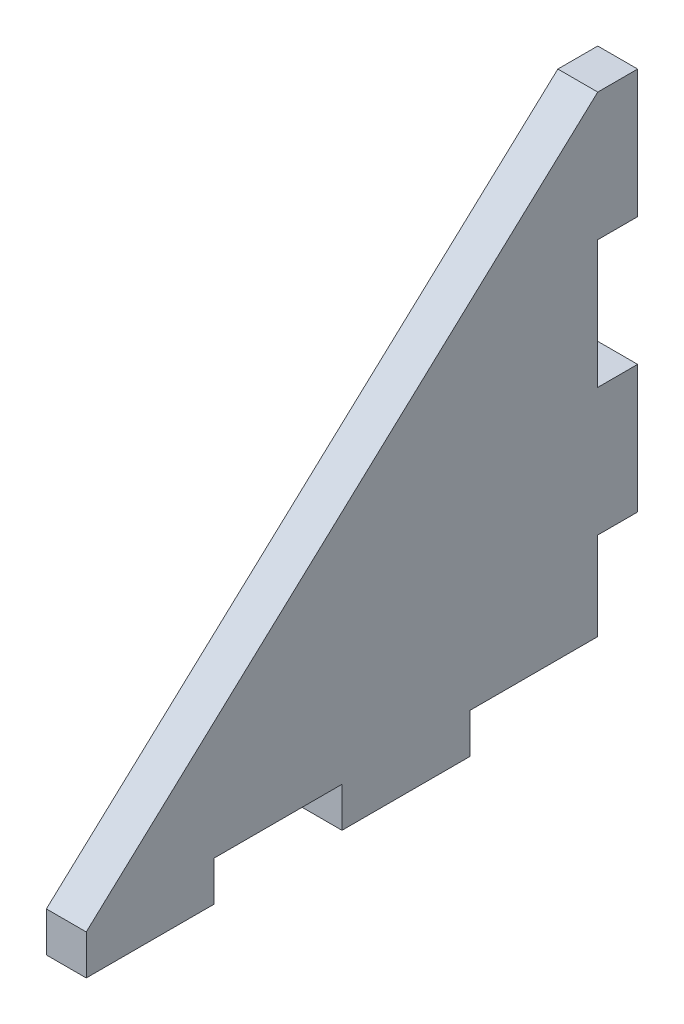
ISO-10303-21;
HEADER;
FILE_DESCRIPTION(('STEP AP214'),'2;1');
FILE_NAME('part.step','',(''),(''),'','','');
FILE_SCHEMA(('AUTOMOTIVE_DESIGN { 1 0 10303 214 1 1 1 1 }'));
ENDSEC;
DATA;
#1=APPLICATION_CONTEXT('core data for automotive mechanical design processes');
#2=APPLICATION_PROTOCOL_DEFINITION('international standard','automotive_design',2000,#1);
#3=PRODUCT_CONTEXT('',#1,'mechanical');
#4=PRODUCT('Part','Part','',(#3));
#5=PRODUCT_RELATED_PRODUCT_CATEGORY('part','',(#4));
#6=PRODUCT_DEFINITION_FORMATION('','',#4);
#7=PRODUCT_DEFINITION_CONTEXT('part definition',#1,'design');
#8=PRODUCT_DEFINITION('design','',#6,#7);
#9=PRODUCT_DEFINITION_SHAPE('','',#8);
#10=(LENGTH_UNIT() NAMED_UNIT(*) SI_UNIT(.MILLI.,.METRE.));
#11=(NAMED_UNIT(*) PLANE_ANGLE_UNIT() SI_UNIT($,.RADIAN.));
#12=(NAMED_UNIT(*) SI_UNIT($,.STERADIAN.) SOLID_ANGLE_UNIT());
#13=UNCERTAINTY_MEASURE_WITH_UNIT(LENGTH_MEASURE(1.E-05),#10,'distance_accuracy_value','');
#14=(GEOMETRIC_REPRESENTATION_CONTEXT(3) GLOBAL_UNCERTAINTY_ASSIGNED_CONTEXT((#13)) GLOBAL_UNIT_ASSIGNED_CONTEXT((#10,
#11,#12)) REPRESENTATION_CONTEXT('',''));
#15=CARTESIAN_POINT('',(0.,0.,0.));
#16=DIRECTION('',(0.,0.,1.));
#17=DIRECTION('',(1.,0.,0.));
#18=AXIS2_PLACEMENT_3D('',#15,#16,#17);
#19=CARTESIAN_POINT('',(3.12,3.12,43.12));
#20=DIRECTION('',(0.,0.735197931303207,0.677852492661556));
#21=DIRECTION('',(0.,-0.677852492661557,0.735197931303207));
#22=AXIS2_PLACEMENT_3D('',#19,#20,#21);
#23=PLANE('',#22);
#24=DIRECTION('',(0.,0.677852492661556,-0.735197931303207));
#25=VECTOR('',#24,1.);
#26=CARTESIAN_POINT('',(0.,3.12,43.12));
#27=LINE('',#26,#25);
#28=CARTESIAN_POINT('',(0.,3.12,43.12));
#29=VERTEX_POINT('',#28);
#30=CARTESIAN_POINT('',(0.,40.,3.12));
#31=VERTEX_POINT('',#30);
#32=EDGE_CURVE('E183',#29,#31,#27,.T.);
#33=ORIENTED_EDGE('',*,*,#32,.F.);
#34=DIRECTION('',(-1.,0.,0.));
#35=VECTOR('',#34,1.);
#36=CARTESIAN_POINT('',(3.12,3.12,43.12));
#37=LINE('',#36,#35);
#38=CARTESIAN_POINT('',(3.12,3.12,43.12));
#39=VERTEX_POINT('',#38);
#40=EDGE_CURVE('E11',#39,#29,#37,.T.);
#41=ORIENTED_EDGE('',*,*,#40,.F.);
#42=DIRECTION('',(0.,0.677852492661556,-0.735197931303207));
#43=VECTOR('',#42,1.);
#44=CARTESIAN_POINT('',(3.12,3.12,43.12));
#45=LINE('',#44,#43);
#46=CARTESIAN_POINT('',(3.12,40.,3.12));
#47=VERTEX_POINT('',#46);
#48=EDGE_CURVE('E230',#39,#47,#45,.T.);
#49=ORIENTED_EDGE('',*,*,#48,.T.);
#50=DIRECTION('',(-1.,0.,0.));
#51=VECTOR('',#50,1.);
#52=CARTESIAN_POINT('',(3.12,40.,3.12));
#53=LINE('',#52,#51);
#54=EDGE_CURVE('E35',#47,#31,#53,.T.);
#55=ORIENTED_EDGE('',*,*,#54,.T.);
#56=EDGE_LOOP('',(#33,#41,#49,#55));
#57=FACE_BOUND('',#56,.T.);
#58=ADVANCED_FACE('F32',(#57),#23,.T.);
#59=CARTESIAN_POINT('',(3.12,0.,43.12));
#60=DIRECTION('',(0.,0.,1.));
#61=DIRECTION('',(1.,0.,0.));
#62=AXIS2_PLACEMENT_3D('',#59,#60,#61);
#63=PLANE('',#62);
#64=DIRECTION('',(0.,1.,0.));
#65=VECTOR('',#64,1.);
#66=CARTESIAN_POINT('',(0.,0.,43.12));
#67=LINE('',#66,#65);
#68=CARTESIAN_POINT('',(0.,0.,43.12));
#69=VERTEX_POINT('',#68);
#70=EDGE_CURVE('E228',#69,#29,#67,.T.);
#71=ORIENTED_EDGE('',*,*,#70,.F.);
#72=DIRECTION('',(-1.,0.,0.));
#73=VECTOR('',#72,1.);
#74=CARTESIAN_POINT('',(3.12,0.,43.12));
#75=LINE('',#74,#73);
#76=CARTESIAN_POINT('',(3.12,0.,43.12));
#77=VERTEX_POINT('',#76);
#78=EDGE_CURVE('E41',#77,#69,#75,.T.);
#79=ORIENTED_EDGE('',*,*,#78,.F.);
#80=DIRECTION('',(0.,1.,0.));
#81=VECTOR('',#80,1.);
#82=CARTESIAN_POINT('',(3.12,0.,43.12));
#83=LINE('',#82,#81);
#84=EDGE_CURVE('E173',#77,#39,#83,.T.);
#85=ORIENTED_EDGE('',*,*,#84,.T.);
#86=ORIENTED_EDGE('',*,*,#40,.T.);
#87=EDGE_LOOP('',(#71,#79,#85,#86));
#88=FACE_BOUND('',#87,.T.);
#89=ADVANCED_FACE('F260',(#88),#63,.T.);
#90=CARTESIAN_POINT('',(3.12,0.,33.12));
#91=DIRECTION('',(0.,-1.,0.));
#92=DIRECTION('',(0.,0.,-1.));
#93=AXIS2_PLACEMENT_3D('',#90,#91,#92);
#94=PLANE('',#93);
#95=DIRECTION('',(0.,0.,1.));
#96=VECTOR('',#95,1.);
#97=CARTESIAN_POINT('',(0.,0.,33.12));
#98=LINE('',#97,#96);
#99=CARTESIAN_POINT('',(0.,0.,33.12));
#100=VERTEX_POINT('',#99);
#101=EDGE_CURVE('E160',#100,#69,#98,.T.);
#102=ORIENTED_EDGE('',*,*,#101,.F.);
#103=DIRECTION('',(-1.,0.,0.));
#104=VECTOR('',#103,1.);
#105=CARTESIAN_POINT('',(3.12,0.,33.12));
#106=LINE('',#105,#104);
#107=CARTESIAN_POINT('',(3.12,0.,33.12));
#108=VERTEX_POINT('',#107);
#109=EDGE_CURVE('E155',#108,#100,#106,.T.);
#110=ORIENTED_EDGE('',*,*,#109,.F.);
#111=DIRECTION('',(0.,0.,1.));
#112=VECTOR('',#111,1.);
#113=CARTESIAN_POINT('',(3.12,0.,33.12));
#114=LINE('',#113,#112);
#115=EDGE_CURVE('E158',#108,#77,#114,.T.);
#116=ORIENTED_EDGE('',*,*,#115,.T.);
#117=ORIENTED_EDGE('',*,*,#78,.T.);
#118=EDGE_LOOP('',(#102,#110,#116,#117));
#119=FACE_BOUND('',#118,.T.);
#120=ADVANCED_FACE('F157',(#119),#94,.T.);
#121=CARTESIAN_POINT('',(3.12,3.12,33.12));
#122=DIRECTION('',(0.,0.,-1.));
#123=DIRECTION('',(-1.,0.,0.));
#124=AXIS2_PLACEMENT_3D('',#121,#122,#123);
#125=PLANE('',#124);
#126=DIRECTION('',(0.,-1.,0.));
#127=VECTOR('',#126,1.);
#128=CARTESIAN_POINT('',(0.,3.12,33.12));
#129=LINE('',#128,#127);
#130=CARTESIAN_POINT('',(0.,3.12,33.12));
#131=VERTEX_POINT('',#130);
#132=EDGE_CURVE('E225',#131,#100,#129,.T.);
#133=ORIENTED_EDGE('',*,*,#132,.F.);
#134=DIRECTION('',(-1.,0.,0.));
#135=VECTOR('',#134,1.);
#136=CARTESIAN_POINT('',(3.12,3.12,33.12));
#137=LINE('',#136,#135);
#138=CARTESIAN_POINT('',(3.12,3.12,33.12));
#139=VERTEX_POINT('',#138);
#140=EDGE_CURVE('E165',#139,#131,#137,.T.);
#141=ORIENTED_EDGE('',*,*,#140,.F.);
#142=DIRECTION('',(0.,-1.,0.));
#143=VECTOR('',#142,1.);
#144=CARTESIAN_POINT('',(3.12,3.12,33.12));
#145=LINE('',#144,#143);
#146=EDGE_CURVE('E171',#139,#108,#145,.T.);
#147=ORIENTED_EDGE('',*,*,#146,.T.);
#148=ORIENTED_EDGE('',*,*,#109,.T.);
#149=EDGE_LOOP('',(#133,#141,#147,#148));
#150=FACE_BOUND('',#149,.T.);
#151=ADVANCED_FACE('F175',(#150),#125,.T.);
#152=CARTESIAN_POINT('',(3.12,3.12,23.12));
#153=DIRECTION('',(0.,-1.,0.));
#154=DIRECTION('',(0.,0.,-1.));
#155=AXIS2_PLACEMENT_3D('',#152,#153,#154);
#156=PLANE('',#155);
#157=DIRECTION('',(0.,0.,1.));
#158=VECTOR('',#157,1.);
#159=CARTESIAN_POINT('',(0.,3.12,23.12));
#160=LINE('',#159,#158);
#161=CARTESIAN_POINT('',(0.,3.12,23.12));
#162=VERTEX_POINT('',#161);
#163=EDGE_CURVE('E222',#162,#131,#160,.T.);
#164=ORIENTED_EDGE('',*,*,#163,.F.);
#165=DIRECTION('',(-1.,0.,0.));
#166=VECTOR('',#165,1.);
#167=CARTESIAN_POINT('',(3.12,3.12,23.12));
#168=LINE('',#167,#166);
#169=CARTESIAN_POINT('',(3.12,3.12,23.12));
#170=VERTEX_POINT('',#169);
#171=EDGE_CURVE('E234',#170,#162,#168,.T.);
#172=ORIENTED_EDGE('',*,*,#171,.F.);
#173=DIRECTION('',(0.,0.,1.));
#174=VECTOR('',#173,1.);
#175=CARTESIAN_POINT('',(3.12,3.12,23.12));
#176=LINE('',#175,#174);
#177=EDGE_CURVE('E176',#170,#139,#176,.T.);
#178=ORIENTED_EDGE('',*,*,#177,.T.);
#179=ORIENTED_EDGE('',*,*,#140,.T.);
#180=EDGE_LOOP('',(#164,#172,#178,#179));
#181=FACE_BOUND('',#180,.T.);
#182=ADVANCED_FACE('F273',(#181),#156,.T.);
#183=CARTESIAN_POINT('',(3.12,0.,23.12));
#184=DIRECTION('',(0.,0.,1.));
#185=DIRECTION('',(1.,0.,0.));
#186=AXIS2_PLACEMENT_3D('',#183,#184,#185);
#187=PLANE('',#186);
#188=DIRECTION('',(0.,1.,0.));
#189=VECTOR('',#188,1.);
#190=CARTESIAN_POINT('',(0.,0.,23.12));
#191=LINE('',#190,#189);
#192=CARTESIAN_POINT('',(0.,0.,23.12));
#193=VERTEX_POINT('',#192);
#194=EDGE_CURVE('E219',#193,#162,#191,.T.);
#195=ORIENTED_EDGE('',*,*,#194,.F.);
#196=DIRECTION('',(-1.,0.,0.));
#197=VECTOR('',#196,1.);
#198=CARTESIAN_POINT('',(3.12,0.,23.12));
#199=LINE('',#198,#197);
#200=CARTESIAN_POINT('',(3.12,0.,23.12));
#201=VERTEX_POINT('',#200);
#202=EDGE_CURVE('E236',#201,#193,#199,.T.);
#203=ORIENTED_EDGE('',*,*,#202,.F.);
#204=DIRECTION('',(0.,1.,0.));
#205=VECTOR('',#204,1.);
#206=CARTESIAN_POINT('',(3.12,0.,23.12));
#207=LINE('',#206,#205);
#208=EDGE_CURVE('E178',#201,#170,#207,.T.);
#209=ORIENTED_EDGE('',*,*,#208,.T.);
#210=ORIENTED_EDGE('',*,*,#171,.T.);
#211=EDGE_LOOP('',(#195,#203,#209,#210));
#212=FACE_BOUND('',#211,.T.);
#213=ADVANCED_FACE('F276',(#212),#187,.T.);
#214=CARTESIAN_POINT('',(3.12,0.,13.12));
#215=DIRECTION('',(0.,-1.,0.));
#216=DIRECTION('',(0.,0.,-1.));
#217=AXIS2_PLACEMENT_3D('',#214,#215,#216);
#218=PLANE('',#217);
#219=DIRECTION('',(0.,0.,1.));
#220=VECTOR('',#219,1.);
#221=CARTESIAN_POINT('',(0.,0.,13.12));
#222=LINE('',#221,#220);
#223=CARTESIAN_POINT('',(0.,0.,13.12));
#224=VERTEX_POINT('',#223);
#225=EDGE_CURVE('E216',#224,#193,#222,.T.);
#226=ORIENTED_EDGE('',*,*,#225,.F.);
#227=DIRECTION('',(-1.,0.,0.));
#228=VECTOR('',#227,1.);
#229=CARTESIAN_POINT('',(3.12,0.,13.12));
#230=LINE('',#229,#228);
#231=CARTESIAN_POINT('',(3.12,0.,13.12));
#232=VERTEX_POINT('',#231);
#233=EDGE_CURVE('E238',#232,#224,#230,.T.);
#234=ORIENTED_EDGE('',*,*,#233,.F.);
#235=DIRECTION('',(0.,0.,1.));
#236=VECTOR('',#235,1.);
#237=CARTESIAN_POINT('',(3.12,0.,13.12));
#238=LINE('',#237,#236);
#239=EDGE_CURVE('E474',#232,#201,#238,.T.);
#240=ORIENTED_EDGE('',*,*,#239,.T.);
#241=ORIENTED_EDGE('',*,*,#202,.T.);
#242=EDGE_LOOP('',(#226,#234,#240,#241));
#243=FACE_BOUND('',#242,.T.);
#244=ADVANCED_FACE('F280',(#243),#218,.T.);
#245=CARTESIAN_POINT('',(3.12,3.12,13.12));
#246=DIRECTION('',(0.,0.,-1.));
#247=DIRECTION('',(-1.,0.,0.));
#248=AXIS2_PLACEMENT_3D('',#245,#246,#247);
#249=PLANE('',#248);
#250=DIRECTION('',(0.,-1.,0.));
#251=VECTOR('',#250,1.);
#252=CARTESIAN_POINT('',(0.,3.12,13.12));
#253=LINE('',#252,#251);
#254=CARTESIAN_POINT('',(0.,3.12,13.12));
#255=VERTEX_POINT('',#254);
#256=EDGE_CURVE('E213',#255,#224,#253,.T.);
#257=ORIENTED_EDGE('',*,*,#256,.F.);
#258=DIRECTION('',(-1.,0.,0.));
#259=VECTOR('',#258,1.);
#260=CARTESIAN_POINT('',(3.12,3.12,13.12));
#261=LINE('',#260,#259);
#262=CARTESIAN_POINT('',(3.12,3.12,13.12));
#263=VERTEX_POINT('',#262);
#264=EDGE_CURVE('E240',#263,#255,#261,.T.);
#265=ORIENTED_EDGE('',*,*,#264,.F.);
#266=DIRECTION('',(0.,-1.,0.));
#267=VECTOR('',#266,1.);
#268=CARTESIAN_POINT('',(3.12,3.12,13.12));
#269=LINE('',#268,#267);
#270=EDGE_CURVE('E467',#263,#232,#269,.T.);
#271=ORIENTED_EDGE('',*,*,#270,.T.);
#272=ORIENTED_EDGE('',*,*,#233,.T.);
#273=EDGE_LOOP('',(#257,#265,#271,#272));
#274=FACE_BOUND('',#273,.T.);
#275=ADVANCED_FACE('F284',(#274),#249,.T.);
#276=CARTESIAN_POINT('',(3.12,3.12,3.12));
#277=DIRECTION('',(0.,-1.,0.));
#278=DIRECTION('',(0.,0.,-1.));
#279=AXIS2_PLACEMENT_3D('',#276,#277,#278);
#280=PLANE('',#279);
#281=DIRECTION('',(0.,0.,1.));
#282=VECTOR('',#281,1.);
#283=CARTESIAN_POINT('',(0.,3.12,3.12));
#284=LINE('',#283,#282);
#285=CARTESIAN_POINT('',(0.,3.12,3.12));
#286=VERTEX_POINT('',#285);
#287=EDGE_CURVE('E210',#286,#255,#284,.T.);
#288=ORIENTED_EDGE('',*,*,#287,.F.);
#289=DIRECTION('',(-1.,0.,0.));
#290=VECTOR('',#289,1.);
#291=CARTESIAN_POINT('',(3.12,3.12,3.12));
#292=LINE('',#291,#290);
#293=CARTESIAN_POINT('',(3.12,3.12,3.12));
#294=VERTEX_POINT('',#293);
#295=EDGE_CURVE('E242',#294,#286,#292,.T.);
#296=ORIENTED_EDGE('',*,*,#295,.F.);
#297=DIRECTION('',(0.,0.,1.));
#298=VECTOR('',#297,1.);
#299=CARTESIAN_POINT('',(3.12,3.12,3.12));
#300=LINE('',#299,#298);
#301=EDGE_CURVE('E463',#294,#263,#300,.T.);
#302=ORIENTED_EDGE('',*,*,#301,.T.);
#303=ORIENTED_EDGE('',*,*,#264,.T.);
#304=EDGE_LOOP('',(#288,#296,#302,#303));
#305=FACE_BOUND('',#304,.T.);
#306=ADVANCED_FACE('F288',(#305),#280,.T.);
#307=CARTESIAN_POINT('',(3.12,10.,3.12));
#308=DIRECTION('',(0.,0.,-1.));
#309=DIRECTION('',(-1.,0.,0.));
#310=AXIS2_PLACEMENT_3D('',#307,#308,#309);
#311=PLANE('',#310);
#312=DIRECTION('',(0.,-1.,0.));
#313=VECTOR('',#312,1.);
#314=CARTESIAN_POINT('',(0.,10.,3.12));
#315=LINE('',#314,#313);
#316=CARTESIAN_POINT('',(0.,10.,3.12));
#317=VERTEX_POINT('',#316);
#318=EDGE_CURVE('E207',#317,#286,#315,.T.);
#319=ORIENTED_EDGE('',*,*,#318,.F.);
#320=DIRECTION('',(-1.,0.,0.));
#321=VECTOR('',#320,1.);
#322=CARTESIAN_POINT('',(3.12,10.,3.12));
#323=LINE('',#322,#321);
#324=CARTESIAN_POINT('',(3.12,10.,3.12));
#325=VERTEX_POINT('',#324);
#326=EDGE_CURVE('E244',#325,#317,#323,.T.);
#327=ORIENTED_EDGE('',*,*,#326,.F.);
#328=DIRECTION('',(0.,-1.,0.));
#329=VECTOR('',#328,1.);
#330=CARTESIAN_POINT('',(3.12,10.,3.12));
#331=LINE('',#330,#329);
#332=EDGE_CURVE('E479',#325,#294,#331,.T.);
#333=ORIENTED_EDGE('',*,*,#332,.T.);
#334=ORIENTED_EDGE('',*,*,#295,.T.);
#335=EDGE_LOOP('',(#319,#327,#333,#334));
#336=FACE_BOUND('',#335,.T.);
#337=ADVANCED_FACE('F292',(#336),#311,.T.);
#338=CARTESIAN_POINT('',(3.12,10.,0.));
#339=DIRECTION('',(0.,-1.,0.));
#340=DIRECTION('',(0.,0.,-1.));
#341=AXIS2_PLACEMENT_3D('',#338,#339,#340);
#342=PLANE('',#341);
#343=DIRECTION('',(0.,0.,1.));
#344=VECTOR('',#343,1.);
#345=CARTESIAN_POINT('',(0.,10.,0.));
#346=LINE('',#345,#344);
#347=CARTESIAN_POINT('',(0.,10.,0.));
#348=VERTEX_POINT('',#347);
#349=EDGE_CURVE('E204',#348,#317,#346,.T.);
#350=ORIENTED_EDGE('',*,*,#349,.F.);
#351=DIRECTION('',(-1.,0.,0.));
#352=VECTOR('',#351,1.);
#353=CARTESIAN_POINT('',(3.12,10.,0.));
#354=LINE('',#353,#352);
#355=CARTESIAN_POINT('',(3.12,10.,0.));
#356=VERTEX_POINT('',#355);
#357=EDGE_CURVE('E246',#356,#348,#354,.T.);
#358=ORIENTED_EDGE('',*,*,#357,.F.);
#359=DIRECTION('',(0.,0.,1.));
#360=VECTOR('',#359,1.);
#361=CARTESIAN_POINT('',(3.12,10.,0.));
#362=LINE('',#361,#360);
#363=EDGE_CURVE('E456',#356,#325,#362,.T.);
#364=ORIENTED_EDGE('',*,*,#363,.T.);
#365=ORIENTED_EDGE('',*,*,#326,.T.);
#366=EDGE_LOOP('',(#350,#358,#364,#365));
#367=FACE_BOUND('',#366,.T.);
#368=ADVANCED_FACE('F296',(#367),#342,.T.);
#369=CARTESIAN_POINT('',(3.12,20.,0.));
#370=DIRECTION('',(0.,0.,-1.));
#371=DIRECTION('',(-1.,0.,0.));
#372=AXIS2_PLACEMENT_3D('',#369,#370,#371);
#373=PLANE('',#372);
#374=DIRECTION('',(0.,-1.,0.));
#375=VECTOR('',#374,1.);
#376=CARTESIAN_POINT('',(0.,20.,0.));
#377=LINE('',#376,#375);
#378=CARTESIAN_POINT('',(0.,20.,0.));
#379=VERTEX_POINT('',#378);
#380=EDGE_CURVE('E201',#379,#348,#377,.T.);
#381=ORIENTED_EDGE('',*,*,#380,.F.);
#382=DIRECTION('',(-1.,0.,0.));
#383=VECTOR('',#382,1.);
#384=CARTESIAN_POINT('',(3.12,20.,0.));
#385=LINE('',#384,#383);
#386=CARTESIAN_POINT('',(3.12,20.,0.));
#387=VERTEX_POINT('',#386);
#388=EDGE_CURVE('E248',#387,#379,#385,.T.);
#389=ORIENTED_EDGE('',*,*,#388,.F.);
#390=DIRECTION('',(0.,-1.,0.));
#391=VECTOR('',#390,1.);
#392=CARTESIAN_POINT('',(3.12,20.,0.));
#393=LINE('',#392,#391);
#394=EDGE_CURVE('E452',#387,#356,#393,.T.);
#395=ORIENTED_EDGE('',*,*,#394,.T.);
#396=ORIENTED_EDGE('',*,*,#357,.T.);
#397=EDGE_LOOP('',(#381,#389,#395,#396));
#398=FACE_BOUND('',#397,.T.);
#399=ADVANCED_FACE('F300',(#398),#373,.T.);
#400=CARTESIAN_POINT('',(3.12,20.,3.12));
#401=DIRECTION('',(0.,1.,0.));
#402=DIRECTION('',(0.,0.,1.));
#403=AXIS2_PLACEMENT_3D('',#400,#401,#402);
#404=PLANE('',#403);
#405=DIRECTION('',(0.,0.,-1.));
#406=VECTOR('',#405,1.);
#407=CARTESIAN_POINT('',(0.,20.,3.12));
#408=LINE('',#407,#406);
#409=CARTESIAN_POINT('',(0.,20.,3.12));
#410=VERTEX_POINT('',#409);
#411=EDGE_CURVE('E198',#410,#379,#408,.T.);
#412=ORIENTED_EDGE('',*,*,#411,.F.);
#413=DIRECTION('',(-1.,0.,0.));
#414=VECTOR('',#413,1.);
#415=CARTESIAN_POINT('',(3.12,20.,3.12));
#416=LINE('',#415,#414);
#417=CARTESIAN_POINT('',(3.12,20.,3.12));
#418=VERTEX_POINT('',#417);
#419=EDGE_CURVE('E250',#418,#410,#416,.T.);
#420=ORIENTED_EDGE('',*,*,#419,.F.);
#421=DIRECTION('',(0.,0.,-1.));
#422=VECTOR('',#421,1.);
#423=CARTESIAN_POINT('',(3.12,20.,3.12));
#424=LINE('',#423,#422);
#425=EDGE_CURVE('E483',#418,#387,#424,.T.);
#426=ORIENTED_EDGE('',*,*,#425,.T.);
#427=ORIENTED_EDGE('',*,*,#388,.T.);
#428=EDGE_LOOP('',(#412,#420,#426,#427));
#429=FACE_BOUND('',#428,.T.);
#430=ADVANCED_FACE('F304',(#429),#404,.T.);
#431=CARTESIAN_POINT('',(3.12,30.,3.12));
#432=DIRECTION('',(0.,0.,-1.));
#433=DIRECTION('',(-1.,0.,0.));
#434=AXIS2_PLACEMENT_3D('',#431,#432,#433);
#435=PLANE('',#434);
#436=DIRECTION('',(0.,-1.,0.));
#437=VECTOR('',#436,1.);
#438=CARTESIAN_POINT('',(0.,30.,3.12));
#439=LINE('',#438,#437);
#440=CARTESIAN_POINT('',(0.,30.,3.12));
#441=VERTEX_POINT('',#440);
#442=EDGE_CURVE('E195',#441,#410,#439,.T.);
#443=ORIENTED_EDGE('',*,*,#442,.F.);
#444=DIRECTION('',(-1.,0.,0.));
#445=VECTOR('',#444,1.);
#446=CARTESIAN_POINT('',(3.12,30.,3.12));
#447=LINE('',#446,#445);
#448=CARTESIAN_POINT('',(3.12,30.,3.12));
#449=VERTEX_POINT('',#448);
#450=EDGE_CURVE('E252',#449,#441,#447,.T.);
#451=ORIENTED_EDGE('',*,*,#450,.F.);
#452=DIRECTION('',(0.,-1.,0.));
#453=VECTOR('',#452,1.);
#454=CARTESIAN_POINT('',(3.12,30.,3.12));
#455=LINE('',#454,#453);
#456=EDGE_CURVE('E445',#449,#418,#455,.T.);
#457=ORIENTED_EDGE('',*,*,#456,.T.);
#458=ORIENTED_EDGE('',*,*,#419,.T.);
#459=EDGE_LOOP('',(#443,#451,#457,#458));
#460=FACE_BOUND('',#459,.T.);
#461=ADVANCED_FACE('F308',(#460),#435,.T.);
#462=CARTESIAN_POINT('',(3.12,30.,0.));
#463=DIRECTION('',(0.,-1.,0.));
#464=DIRECTION('',(0.,0.,-1.));
#465=AXIS2_PLACEMENT_3D('',#462,#463,#464);
#466=PLANE('',#465);
#467=DIRECTION('',(0.,0.,1.));
#468=VECTOR('',#467,1.);
#469=CARTESIAN_POINT('',(0.,30.,0.));
#470=LINE('',#469,#468);
#471=CARTESIAN_POINT('',(0.,30.,0.));
#472=VERTEX_POINT('',#471);
#473=EDGE_CURVE('E192',#472,#441,#470,.T.);
#474=ORIENTED_EDGE('',*,*,#473,.F.);
#475=DIRECTION('',(-1.,0.,0.));
#476=VECTOR('',#475,1.);
#477=CARTESIAN_POINT('',(3.12,30.,0.));
#478=LINE('',#477,#476);
#479=CARTESIAN_POINT('',(3.12,30.,0.));
#480=VERTEX_POINT('',#479);
#481=EDGE_CURVE('E254',#480,#472,#478,.T.);
#482=ORIENTED_EDGE('',*,*,#481,.F.);
#483=DIRECTION('',(0.,0.,1.));
#484=VECTOR('',#483,1.);
#485=CARTESIAN_POINT('',(3.12,30.,0.));
#486=LINE('',#485,#484);
#487=EDGE_CURVE('E441',#480,#449,#486,.T.);
#488=ORIENTED_EDGE('',*,*,#487,.T.);
#489=ORIENTED_EDGE('',*,*,#450,.T.);
#490=EDGE_LOOP('',(#474,#482,#488,#489));
#491=FACE_BOUND('',#490,.T.);
#492=ADVANCED_FACE('F312',(#491),#466,.T.);
#493=CARTESIAN_POINT('',(3.12,40.,0.));
#494=DIRECTION('',(0.,0.,-1.));
#495=DIRECTION('',(-1.,0.,0.));
#496=AXIS2_PLACEMENT_3D('',#493,#494,#495);
#497=PLANE('',#496);
#498=DIRECTION('',(0.,-1.,0.));
#499=VECTOR('',#498,1.);
#500=CARTESIAN_POINT('',(0.,40.,0.));
#501=LINE('',#500,#499);
#502=CARTESIAN_POINT('',(0.,40.,0.));
#503=VERTEX_POINT('',#502);
#504=EDGE_CURVE('E189',#503,#472,#501,.T.);
#505=ORIENTED_EDGE('',*,*,#504,.F.);
#506=DIRECTION('',(-1.,0.,0.));
#507=VECTOR('',#506,1.);
#508=CARTESIAN_POINT('',(3.12,40.,0.));
#509=LINE('',#508,#507);
#510=CARTESIAN_POINT('',(3.12,40.,0.));
#511=VERTEX_POINT('',#510);
#512=EDGE_CURVE('E255',#511,#503,#509,.T.);
#513=ORIENTED_EDGE('',*,*,#512,.F.);
#514=DIRECTION('',(0.,-1.,0.));
#515=VECTOR('',#514,1.);
#516=CARTESIAN_POINT('',(3.12,40.,0.));
#517=LINE('',#516,#515);
#518=EDGE_CURVE('E487',#511,#480,#517,.T.);
#519=ORIENTED_EDGE('',*,*,#518,.T.);
#520=ORIENTED_EDGE('',*,*,#481,.T.);
#521=EDGE_LOOP('',(#505,#513,#519,#520));
#522=FACE_BOUND('',#521,.T.);
#523=ADVANCED_FACE('F316',(#522),#497,.T.);
#524=CARTESIAN_POINT('',(3.12,40.,3.12));
#525=DIRECTION('',(0.,1.,0.));
#526=DIRECTION('',(0.,0.,1.));
#527=AXIS2_PLACEMENT_3D('',#524,#525,#526);
#528=PLANE('',#527);
#529=DIRECTION('',(0.,0.,-1.));
#530=VECTOR('',#529,1.);
#531=CARTESIAN_POINT('',(0.,40.,3.12));
#532=LINE('',#531,#530);
#533=EDGE_CURVE('E186',#31,#503,#532,.T.);
#534=ORIENTED_EDGE('',*,*,#533,.F.);
#535=ORIENTED_EDGE('',*,*,#54,.F.);
#536=DIRECTION('',(0.,0.,-1.));
#537=VECTOR('',#536,1.);
#538=CARTESIAN_POINT('',(3.12,40.,3.12));
#539=LINE('',#538,#537);
#540=EDGE_CURVE('E489',#47,#511,#539,.T.);
#541=ORIENTED_EDGE('',*,*,#540,.T.);
#542=ORIENTED_EDGE('',*,*,#512,.T.);
#543=EDGE_LOOP('',(#534,#535,#541,#542));
#544=FACE_BOUND('',#543,.T.);
#545=ADVANCED_FACE('F257',(#544),#528,.T.);
#546=CARTESIAN_POINT('',(3.12,0.,0.));
#547=DIRECTION('',(-1.,0.,0.));
#548=DIRECTION('',(0.,0.,1.));
#549=AXIS2_PLACEMENT_3D('',#546,#547,#548);
#550=PLANE('',#549);
#551=ORIENTED_EDGE('',*,*,#48,.F.);
#552=ORIENTED_EDGE('',*,*,#84,.F.);
#553=ORIENTED_EDGE('',*,*,#115,.F.);
#554=ORIENTED_EDGE('',*,*,#146,.F.);
#555=ORIENTED_EDGE('',*,*,#177,.F.);
#556=ORIENTED_EDGE('',*,*,#208,.F.);
#557=ORIENTED_EDGE('',*,*,#239,.F.);
#558=ORIENTED_EDGE('',*,*,#270,.F.);
#559=ORIENTED_EDGE('',*,*,#301,.F.);
#560=ORIENTED_EDGE('',*,*,#332,.F.);
#561=ORIENTED_EDGE('',*,*,#363,.F.);
#562=ORIENTED_EDGE('',*,*,#394,.F.);
#563=ORIENTED_EDGE('',*,*,#425,.F.);
#564=ORIENTED_EDGE('',*,*,#456,.F.);
#565=ORIENTED_EDGE('',*,*,#487,.F.);
#566=ORIENTED_EDGE('',*,*,#518,.F.);
#567=ORIENTED_EDGE('',*,*,#540,.F.);
#568=EDGE_LOOP('',(#551,#552,#553,#554,#555,#556,#557,#558,#559,#560,#561,#562,#563,#564,#565,
#566,#567));
#569=FACE_BOUND('',#568,.T.);
#570=ADVANCED_FACE('F169',(#569),#550,.F.);
#571=CARTESIAN_POINT('',(0.,0.,0.));
#572=DIRECTION('',(-1.,0.,0.));
#573=DIRECTION('',(0.,0.,1.));
#574=AXIS2_PLACEMENT_3D('',#571,#572,#573);
#575=PLANE('',#574);
#576=ORIENTED_EDGE('',*,*,#32,.T.);
#577=ORIENTED_EDGE('',*,*,#533,.T.);
#578=ORIENTED_EDGE('',*,*,#504,.T.);
#579=ORIENTED_EDGE('',*,*,#473,.T.);
#580=ORIENTED_EDGE('',*,*,#442,.T.);
#581=ORIENTED_EDGE('',*,*,#411,.T.);
#582=ORIENTED_EDGE('',*,*,#380,.T.);
#583=ORIENTED_EDGE('',*,*,#349,.T.);
#584=ORIENTED_EDGE('',*,*,#318,.T.);
#585=ORIENTED_EDGE('',*,*,#287,.T.);
#586=ORIENTED_EDGE('',*,*,#256,.T.);
#587=ORIENTED_EDGE('',*,*,#225,.T.);
#588=ORIENTED_EDGE('',*,*,#194,.T.);
#589=ORIENTED_EDGE('',*,*,#163,.T.);
#590=ORIENTED_EDGE('',*,*,#132,.T.);
#591=ORIENTED_EDGE('',*,*,#101,.T.);
#592=ORIENTED_EDGE('',*,*,#70,.T.);
#593=EDGE_LOOP('',(#576,#577,#578,#579,#580,#581,#582,#583,#584,#585,#586,#587,#588,#589,#590,
#591,#592));
#594=FACE_BOUND('',#593,.T.);
#595=ADVANCED_FACE('F259',(#594),#575,.T.);
#596=CLOSED_SHELL('',(#58,#89,#120,#151,#182,#213,#244,#275,#306,#337,#368,#399,#430,#461,#492,
#523,#545,#570,#595));
#597=MANIFOLD_SOLID_BREP('B2',#596);
#598=ADVANCED_BREP_SHAPE_REPRESENTATION('',(#18,#597),#14);
#599=SHAPE_DEFINITION_REPRESENTATION(#9,#598);
ENDSEC;
END-ISO-10303-21;
